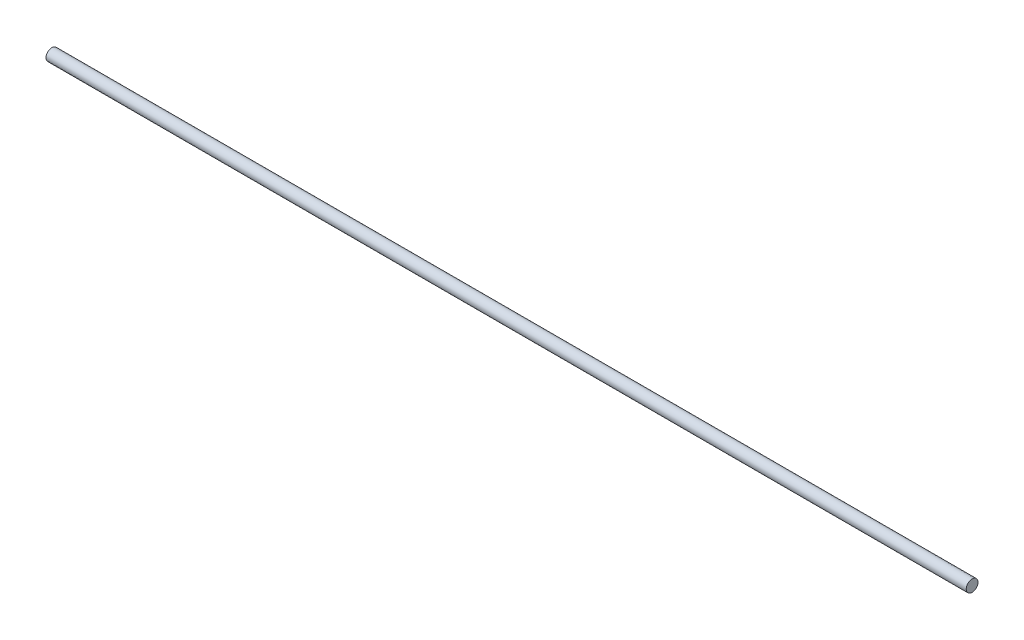
ISO-10303-21;
HEADER;
FILE_DESCRIPTION(('STEP AP214'),'2;1');
FILE_NAME('part.step','',(''),(''),'','','');
FILE_SCHEMA(('AUTOMOTIVE_DESIGN { 1 0 10303 214 1 1 1 1 }'));
ENDSEC;
DATA;
#1=APPLICATION_CONTEXT('core data for automotive mechanical design processes');
#2=APPLICATION_PROTOCOL_DEFINITION('international standard','automotive_design',2000,#1);
#3=PRODUCT_CONTEXT('',#1,'mechanical');
#4=PRODUCT('Part','Part','',(#3));
#5=PRODUCT_RELATED_PRODUCT_CATEGORY('part','',(#4));
#6=PRODUCT_DEFINITION_FORMATION('','',#4);
#7=PRODUCT_DEFINITION_CONTEXT('part definition',#1,'design');
#8=PRODUCT_DEFINITION('design','',#6,#7);
#9=PRODUCT_DEFINITION_SHAPE('','',#8);
#10=(LENGTH_UNIT() NAMED_UNIT(*) SI_UNIT(.MILLI.,.METRE.));
#11=(NAMED_UNIT(*) PLANE_ANGLE_UNIT() SI_UNIT($,.RADIAN.));
#12=(NAMED_UNIT(*) SI_UNIT($,.STERADIAN.) SOLID_ANGLE_UNIT());
#13=UNCERTAINTY_MEASURE_WITH_UNIT(LENGTH_MEASURE(1.E-05),#10,'distance_accuracy_value','');
#14=(GEOMETRIC_REPRESENTATION_CONTEXT(3) GLOBAL_UNCERTAINTY_ASSIGNED_CONTEXT((#13)) GLOBAL_UNIT_ASSIGNED_CONTEXT((#10,
#11,#12)) REPRESENTATION_CONTEXT('',''));
#15=CARTESIAN_POINT('',(0.,0.,0.));
#16=DIRECTION('',(0.,0.,1.));
#17=DIRECTION('',(1.,0.,0.));
#18=AXIS2_PLACEMENT_3D('',#15,#16,#17);
#19=CARTESIAN_POINT('',(-34.,0.,0.));
#20=DIRECTION('',(1.,0.,0.));
#21=DIRECTION('',(0.,0.,-1.));
#22=AXIS2_PLACEMENT_3D('',#19,#20,#21);
#23=CYLINDRICAL_SURFACE('',#22,1.4);
#24=CARTESIAN_POINT('',(-34.,0.,0.));
#25=DIRECTION('',(1.,0.,0.));
#26=DIRECTION('',(0.,0.,-1.));
#27=AXIS2_PLACEMENT_3D('',#24,#25,#26);
#28=CIRCLE('',#27,1.4);
#29=CARTESIAN_POINT('',(-34.,0.,-1.4));
#30=VERTEX_POINT('',#29);
#31=EDGE_CURVE('E10',#30,#30,#28,.T.);
#32=ORIENTED_EDGE('',*,*,#31,.T.);
#33=EDGE_LOOP('',(#32));
#34=FACE_BOUND('',#33,.T.);
#35=CARTESIAN_POINT('',(185.,0.,0.));
#36=DIRECTION('',(1.,0.,0.));
#37=DIRECTION('',(0.,0.,-1.));
#38=AXIS2_PLACEMENT_3D('',#35,#36,#37);
#39=CIRCLE('',#38,1.4);
#40=CARTESIAN_POINT('',(185.,0.,-1.4));
#41=VERTEX_POINT('',#40);
#42=EDGE_CURVE('E38',#41,#41,#39,.T.);
#43=ORIENTED_EDGE('',*,*,#42,.F.);
#44=EDGE_LOOP('',(#43));
#45=FACE_BOUND('',#44,.T.);
#46=ADVANCED_FACE('F32',(#34,#45),#23,.T.);
#47=CARTESIAN_POINT('',(-34.,0.,0.));
#48=DIRECTION('',(1.,0.,0.));
#49=DIRECTION('',(0.,0.,-1.));
#50=AXIS2_PLACEMENT_3D('',#47,#48,#49);
#51=PLANE('',#50);
#52=ORIENTED_EDGE('',*,*,#31,.F.);
#53=EDGE_LOOP('',(#52));
#54=FACE_BOUND('',#53,.T.);
#55=ADVANCED_FACE('F47',(#54),#51,.F.);
#56=CARTESIAN_POINT('',(185.,0.,0.));
#57=DIRECTION('',(1.,0.,0.));
#58=DIRECTION('',(0.,0.,-1.));
#59=AXIS2_PLACEMENT_3D('',#56,#57,#58);
#60=PLANE('',#59);
#61=ORIENTED_EDGE('',*,*,#42,.T.);
#62=EDGE_LOOP('',(#61));
#63=FACE_BOUND('',#62,.T.);
#64=ADVANCED_FACE('F44',(#63),#60,.T.);
#65=CLOSED_SHELL('',(#46,#55,#64));
#66=MANIFOLD_SOLID_BREP('B2',#65);
#67=ADVANCED_BREP_SHAPE_REPRESENTATION('',(#18,#66),#14);
#68=SHAPE_DEFINITION_REPRESENTATION(#9,#67);
ENDSEC;
END-ISO-10303-21;
